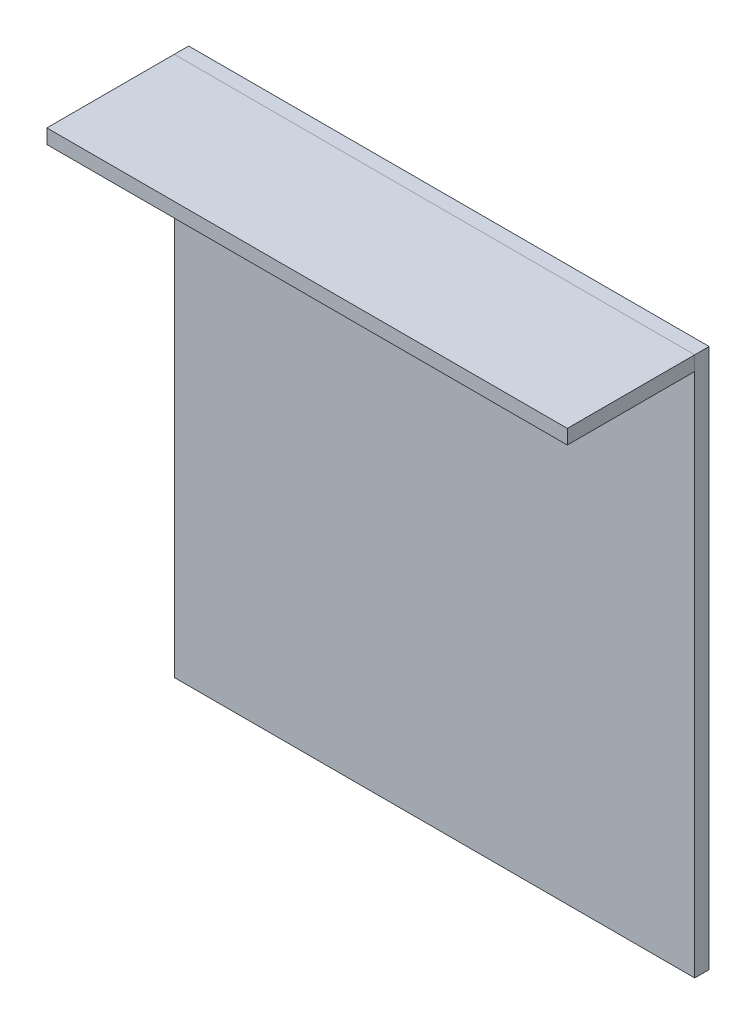
ISO-10303-21;
HEADER;
FILE_DESCRIPTION(('STEP AP214'),'2;1');
FILE_NAME('part.step','',(''),(''),'','','');
FILE_SCHEMA(('AUTOMOTIVE_DESIGN { 1 0 10303 214 1 1 1 1 }'));
ENDSEC;
DATA;
#1=APPLICATION_CONTEXT('core data for automotive mechanical design processes');
#2=APPLICATION_PROTOCOL_DEFINITION('international standard','automotive_design',2000,#1);
#3=PRODUCT_CONTEXT('',#1,'mechanical');
#4=PRODUCT('Part','Part','',(#3));
#5=PRODUCT_RELATED_PRODUCT_CATEGORY('part','',(#4));
#6=PRODUCT_DEFINITION_FORMATION('','',#4);
#7=PRODUCT_DEFINITION_CONTEXT('part definition',#1,'design');
#8=PRODUCT_DEFINITION('design','',#6,#7);
#9=PRODUCT_DEFINITION_SHAPE('','',#8);
#10=(LENGTH_UNIT() NAMED_UNIT(*) SI_UNIT(.MILLI.,.METRE.));
#11=(NAMED_UNIT(*) PLANE_ANGLE_UNIT() SI_UNIT($,.RADIAN.));
#12=(NAMED_UNIT(*) SI_UNIT($,.STERADIAN.) SOLID_ANGLE_UNIT());
#13=UNCERTAINTY_MEASURE_WITH_UNIT(LENGTH_MEASURE(1.E-05),#10,'distance_accuracy_value','');
#14=(GEOMETRIC_REPRESENTATION_CONTEXT(3) GLOBAL_UNCERTAINTY_ASSIGNED_CONTEXT((#13)) GLOBAL_UNIT_ASSIGNED_CONTEXT((#10,
#11,#12)) REPRESENTATION_CONTEXT('',''));
#15=CARTESIAN_POINT('',(0.,0.,0.));
#16=DIRECTION('',(0.,0.,1.));
#17=DIRECTION('',(1.,0.,0.));
#18=AXIS2_PLACEMENT_3D('',#15,#16,#17);
#19=CARTESIAN_POINT('',(216.5,219.,118.));
#20=DIRECTION('',(-1.,0.,0.));
#21=DIRECTION('',(0.,0.,1.));
#22=AXIS2_PLACEMENT_3D('',#19,#20,#21);
#23=PLANE('',#22);
#24=DIRECTION('',(0.,1.,0.));
#25=VECTOR('',#24,1.);
#26=CARTESIAN_POINT('',(216.5,219.,12.));
#27=LINE('',#26,#25);
#28=CARTESIAN_POINT('',(216.5,207.,12.));
#29=VERTEX_POINT('',#28);
#30=CARTESIAN_POINT('',(216.5,219.,12.));
#31=VERTEX_POINT('',#30);
#32=EDGE_CURVE('E108',#29,#31,#27,.T.);
#33=ORIENTED_EDGE('',*,*,#32,.T.);
#34=DIRECTION('',(0.,0.,-1.));
#35=VECTOR('',#34,1.);
#36=CARTESIAN_POINT('',(216.5,219.,118.));
#37=LINE('',#36,#35);
#38=CARTESIAN_POINT('',(216.5,219.,118.));
#39=VERTEX_POINT('',#38);
#40=EDGE_CURVE('E12',#39,#31,#37,.T.);
#41=ORIENTED_EDGE('',*,*,#40,.F.);
#42=DIRECTION('',(0.,1.,0.));
#43=VECTOR('',#42,1.);
#44=CARTESIAN_POINT('',(216.5,219.,118.));
#45=LINE('',#44,#43);
#46=CARTESIAN_POINT('',(216.5,207.,118.));
#47=VERTEX_POINT('',#46);
#48=EDGE_CURVE('E96',#47,#39,#45,.T.);
#49=ORIENTED_EDGE('',*,*,#48,.F.);
#50=DIRECTION('',(0.,0.,-1.));
#51=VECTOR('',#50,1.);
#52=CARTESIAN_POINT('',(216.5,207.,118.));
#53=LINE('',#52,#51);
#54=EDGE_CURVE('E104',#47,#29,#53,.T.);
#55=ORIENTED_EDGE('',*,*,#54,.T.);
#56=EDGE_LOOP('',(#33,#41,#49,#55));
#57=FACE_BOUND('',#56,.T.);
#58=ADVANCED_FACE('F45',(#57),#23,.F.);
#59=CARTESIAN_POINT('',(216.5,219.,118.));
#60=DIRECTION('',(0.,-1.,0.));
#61=DIRECTION('',(1.,0.,0.));
#62=AXIS2_PLACEMENT_3D('',#59,#60,#61);
#63=PLANE('',#62);
#64=DIRECTION('',(-1.,0.,0.));
#65=VECTOR('',#64,1.);
#66=CARTESIAN_POINT('',(216.5,219.,12.));
#67=LINE('',#66,#65);
#68=CARTESIAN_POINT('',(-216.5,219.,12.));
#69=VERTEX_POINT('',#68);
#70=EDGE_CURVE('E100',#31,#69,#67,.T.);
#71=ORIENTED_EDGE('',*,*,#70,.T.);
#72=DIRECTION('',(0.,0.,-1.));
#73=VECTOR('',#72,1.);
#74=CARTESIAN_POINT('',(-216.5,219.,118.));
#75=LINE('',#74,#73);
#76=CARTESIAN_POINT('',(-216.5,219.,118.));
#77=VERTEX_POINT('',#76);
#78=EDGE_CURVE('E53',#77,#69,#75,.T.);
#79=ORIENTED_EDGE('',*,*,#78,.F.);
#80=DIRECTION('',(-1.,0.,0.));
#81=VECTOR('',#80,1.);
#82=CARTESIAN_POINT('',(216.5,219.,118.));
#83=LINE('',#82,#81);
#84=EDGE_CURVE('E91',#39,#77,#83,.T.);
#85=ORIENTED_EDGE('',*,*,#84,.F.);
#86=ORIENTED_EDGE('',*,*,#40,.T.);
#87=EDGE_LOOP('',(#71,#79,#85,#86));
#88=FACE_BOUND('',#87,.T.);
#89=ADVANCED_FACE('F99',(#88),#63,.F.);
#90=CARTESIAN_POINT('',(-216.5,219.,118.));
#91=DIRECTION('',(1.,0.,0.));
#92=DIRECTION('',(0.,0.,-1.));
#93=AXIS2_PLACEMENT_3D('',#90,#91,#92);
#94=PLANE('',#93);
#95=DIRECTION('',(0.,-1.,0.));
#96=VECTOR('',#95,1.);
#97=CARTESIAN_POINT('',(-216.5,219.,12.));
#98=LINE('',#97,#96);
#99=CARTESIAN_POINT('',(-216.5,207.,12.));
#100=VERTEX_POINT('',#99);
#101=EDGE_CURVE('E78',#69,#100,#98,.T.);
#102=ORIENTED_EDGE('',*,*,#101,.T.);
#103=DIRECTION('',(0.,0.,-1.));
#104=VECTOR('',#103,1.);
#105=CARTESIAN_POINT('',(-216.5,207.,118.));
#106=LINE('',#105,#104);
#107=CARTESIAN_POINT('',(-216.5,207.,118.));
#108=VERTEX_POINT('',#107);
#109=EDGE_CURVE('E101',#108,#100,#106,.T.);
#110=ORIENTED_EDGE('',*,*,#109,.F.);
#111=DIRECTION('',(0.,-1.,0.));
#112=VECTOR('',#111,1.);
#113=CARTESIAN_POINT('',(-216.5,219.,118.));
#114=LINE('',#113,#112);
#115=EDGE_CURVE('E94',#77,#108,#114,.T.);
#116=ORIENTED_EDGE('',*,*,#115,.F.);
#117=ORIENTED_EDGE('',*,*,#78,.T.);
#118=EDGE_LOOP('',(#102,#110,#116,#117));
#119=FACE_BOUND('',#118,.T.);
#120=ADVANCED_FACE('F102',(#119),#94,.F.);
#121=CARTESIAN_POINT('',(216.5,207.,118.));
#122=DIRECTION('',(0.,1.,0.));
#123=DIRECTION('',(-1.,0.,0.));
#124=AXIS2_PLACEMENT_3D('',#121,#122,#123);
#125=PLANE('',#124);
#126=DIRECTION('',(1.,0.,0.));
#127=VECTOR('',#126,1.);
#128=CARTESIAN_POINT('',(216.5,207.,12.));
#129=LINE('',#128,#127);
#130=EDGE_CURVE('E84',#100,#29,#129,.T.);
#131=ORIENTED_EDGE('',*,*,#130,.T.);
#132=ORIENTED_EDGE('',*,*,#54,.F.);
#133=DIRECTION('',(1.,0.,0.));
#134=VECTOR('',#133,1.);
#135=CARTESIAN_POINT('',(216.5,207.,118.));
#136=LINE('',#135,#134);
#137=EDGE_CURVE('E61',#108,#47,#136,.T.);
#138=ORIENTED_EDGE('',*,*,#137,.F.);
#139=ORIENTED_EDGE('',*,*,#109,.T.);
#140=EDGE_LOOP('',(#131,#132,#138,#139));
#141=FACE_BOUND('',#140,.T.);
#142=ADVANCED_FACE('F115',(#141),#125,.F.);
#143=CARTESIAN_POINT('',(0.,0.,118.));
#144=DIRECTION('',(0.,0.,-1.));
#145=DIRECTION('',(-1.,0.,0.));
#146=AXIS2_PLACEMENT_3D('',#143,#144,#145);
#147=PLANE('',#146);
#148=ORIENTED_EDGE('',*,*,#48,.T.);
#149=ORIENTED_EDGE('',*,*,#84,.T.);
#150=ORIENTED_EDGE('',*,*,#115,.T.);
#151=ORIENTED_EDGE('',*,*,#137,.T.);
#152=EDGE_LOOP('',(#148,#149,#150,#151));
#153=FACE_BOUND('',#152,.T.);
#154=ADVANCED_FACE('F92',(#153),#147,.F.);
#155=CARTESIAN_POINT('',(0.,0.,12.));
#156=DIRECTION('',(0.,0.,-1.));
#157=DIRECTION('',(-1.,0.,0.));
#158=AXIS2_PLACEMENT_3D('',#155,#156,#157);
#159=PLANE('',#158);
#160=ORIENTED_EDGE('',*,*,#32,.F.);
#161=ORIENTED_EDGE('',*,*,#130,.F.);
#162=ORIENTED_EDGE('',*,*,#101,.F.);
#163=ORIENTED_EDGE('',*,*,#70,.F.);
#164=EDGE_LOOP('',(#160,#161,#162,#163));
#165=FACE_BOUND('',#164,.T.);
#166=ADVANCED_FACE('F118',(#165),#159,.T.);
#167=CLOSED_SHELL('',(#58,#89,#120,#142,#154,#166));
#168=MANIFOLD_SOLID_BREP('B2',#167);
#169=CARTESIAN_POINT('',(-216.5,-230.,12.));
#170=DIRECTION('',(1.,0.,0.));
#171=DIRECTION('',(0.,1.,0.));
#172=AXIS2_PLACEMENT_3D('',#169,#170,#171);
#173=PLANE('',#172);
#174=DIRECTION('',(0.,-1.,0.));
#175=VECTOR('',#174,1.);
#176=CARTESIAN_POINT('',(-216.5,-230.,0.));
#177=LINE('',#176,#175);
#178=CARTESIAN_POINT('',(-216.5,219.,0.));
#179=VERTEX_POINT('',#178);
#180=CARTESIAN_POINT('',(-216.5,-230.,0.));
#181=VERTEX_POINT('',#180);
#182=EDGE_CURVE('E232',#179,#181,#177,.T.);
#183=ORIENTED_EDGE('',*,*,#182,.T.);
#184=DIRECTION('',(0.,0.,-1.));
#185=VECTOR('',#184,1.);
#186=CARTESIAN_POINT('',(-216.5,-230.,12.));
#187=LINE('',#186,#185);
#188=CARTESIAN_POINT('',(-216.5,-230.,12.));
#189=VERTEX_POINT('',#188);
#190=EDGE_CURVE('E43',#189,#181,#187,.T.);
#191=ORIENTED_EDGE('',*,*,#190,.F.);
#192=DIRECTION('',(0.,-1.,0.));
#193=VECTOR('',#192,1.);
#194=CARTESIAN_POINT('',(-216.5,-230.,12.));
#195=LINE('',#194,#193);
#196=CARTESIAN_POINT('',(-216.5,219.,12.));
#197=VERTEX_POINT('',#196);
#198=EDGE_CURVE('E220',#197,#189,#195,.T.);
#199=ORIENTED_EDGE('',*,*,#198,.F.);
#200=DIRECTION('',(0.,0.,-1.));
#201=VECTOR('',#200,1.);
#202=CARTESIAN_POINT('',(-216.5,219.,12.));
#203=LINE('',#202,#201);
#204=EDGE_CURVE('E228',#197,#179,#203,.T.);
#205=ORIENTED_EDGE('',*,*,#204,.T.);
#206=EDGE_LOOP('',(#183,#191,#199,#205));
#207=FACE_BOUND('',#206,.T.);
#208=ADVANCED_FACE('F169',(#207),#173,.F.);
#209=CARTESIAN_POINT('',(-216.5,-230.,12.));
#210=DIRECTION('',(0.,1.,0.));
#211=DIRECTION('',(-1.,0.,0.));
#212=AXIS2_PLACEMENT_3D('',#209,#210,#211);
#213=PLANE('',#212);
#214=DIRECTION('',(1.,0.,0.));
#215=VECTOR('',#214,1.);
#216=CARTESIAN_POINT('',(-216.5,-230.,0.));
#217=LINE('',#216,#215);
#218=CARTESIAN_POINT('',(216.5,-230.,0.));
#219=VERTEX_POINT('',#218);
#220=EDGE_CURVE('E224',#181,#219,#217,.T.);
#221=ORIENTED_EDGE('',*,*,#220,.T.);
#222=DIRECTION('',(0.,0.,-1.));
#223=VECTOR('',#222,1.);
#224=CARTESIAN_POINT('',(216.5,-230.,12.));
#225=LINE('',#224,#223);
#226=CARTESIAN_POINT('',(216.5,-230.,12.));
#227=VERTEX_POINT('',#226);
#228=EDGE_CURVE('E177',#227,#219,#225,.T.);
#229=ORIENTED_EDGE('',*,*,#228,.F.);
#230=DIRECTION('',(1.,0.,0.));
#231=VECTOR('',#230,1.);
#232=CARTESIAN_POINT('',(-216.5,-230.,12.));
#233=LINE('',#232,#231);
#234=EDGE_CURVE('E215',#189,#227,#233,.T.);
#235=ORIENTED_EDGE('',*,*,#234,.F.);
#236=ORIENTED_EDGE('',*,*,#190,.T.);
#237=EDGE_LOOP('',(#221,#229,#235,#236));
#238=FACE_BOUND('',#237,.T.);
#239=ADVANCED_FACE('F223',(#238),#213,.F.);
#240=CARTESIAN_POINT('',(216.5,-230.,12.));
#241=DIRECTION('',(-1.,0.,0.));
#242=DIRECTION('',(0.,-1.,0.));
#243=AXIS2_PLACEMENT_3D('',#240,#241,#242);
#244=PLANE('',#243);
#245=DIRECTION('',(0.,1.,0.));
#246=VECTOR('',#245,1.);
#247=CARTESIAN_POINT('',(216.5,-230.,0.));
#248=LINE('',#247,#246);
#249=CARTESIAN_POINT('',(216.5,219.,0.));
#250=VERTEX_POINT('',#249);
#251=EDGE_CURVE('E202',#219,#250,#248,.T.);
#252=ORIENTED_EDGE('',*,*,#251,.T.);
#253=DIRECTION('',(0.,0.,-1.));
#254=VECTOR('',#253,1.);
#255=CARTESIAN_POINT('',(216.5,219.,12.));
#256=LINE('',#255,#254);
#257=CARTESIAN_POINT('',(216.5,219.,12.));
#258=VERTEX_POINT('',#257);
#259=EDGE_CURVE('E225',#258,#250,#256,.T.);
#260=ORIENTED_EDGE('',*,*,#259,.F.);
#261=DIRECTION('',(0.,1.,0.));
#262=VECTOR('',#261,1.);
#263=CARTESIAN_POINT('',(216.5,-230.,12.));
#264=LINE('',#263,#262);
#265=EDGE_CURVE('E218',#227,#258,#264,.T.);
#266=ORIENTED_EDGE('',*,*,#265,.F.);
#267=ORIENTED_EDGE('',*,*,#228,.T.);
#268=EDGE_LOOP('',(#252,#260,#266,#267));
#269=FACE_BOUND('',#268,.T.);
#270=ADVANCED_FACE('F226',(#269),#244,.F.);
#271=CARTESIAN_POINT('',(-216.5,219.,12.));
#272=DIRECTION('',(0.,-1.,0.));
#273=DIRECTION('',(0.,0.,-1.));
#274=AXIS2_PLACEMENT_3D('',#271,#272,#273);
#275=PLANE('',#274);
#276=DIRECTION('',(-1.,0.,0.));
#277=VECTOR('',#276,1.);
#278=CARTESIAN_POINT('',(-216.5,219.,0.));
#279=LINE('',#278,#277);
#280=EDGE_CURVE('E208',#250,#179,#279,.T.);
#281=ORIENTED_EDGE('',*,*,#280,.T.);
#282=ORIENTED_EDGE('',*,*,#204,.F.);
#283=DIRECTION('',(-1.,0.,0.));
#284=VECTOR('',#283,1.);
#285=CARTESIAN_POINT('',(-216.5,219.,12.));
#286=LINE('',#285,#284);
#287=EDGE_CURVE('E185',#258,#197,#286,.T.);
#288=ORIENTED_EDGE('',*,*,#287,.F.);
#289=ORIENTED_EDGE('',*,*,#259,.T.);
#290=EDGE_LOOP('',(#281,#282,#288,#289));
#291=FACE_BOUND('',#290,.T.);
#292=ADVANCED_FACE('F240',(#291),#275,.F.);
#293=CARTESIAN_POINT('',(0.,0.,12.));
#294=DIRECTION('',(0.,0.,-1.));
#295=DIRECTION('',(-1.,0.,0.));
#296=AXIS2_PLACEMENT_3D('',#293,#294,#295);
#297=PLANE('',#296);
#298=ORIENTED_EDGE('',*,*,#198,.T.);
#299=ORIENTED_EDGE('',*,*,#234,.T.);
#300=ORIENTED_EDGE('',*,*,#265,.T.);
#301=ORIENTED_EDGE('',*,*,#287,.T.);
#302=EDGE_LOOP('',(#298,#299,#300,#301));
#303=FACE_BOUND('',#302,.T.);
#304=ADVANCED_FACE('F216',(#303),#297,.F.);
#305=CARTESIAN_POINT('',(0.,0.,0.));
#306=DIRECTION('',(0.,0.,-1.));
#307=DIRECTION('',(-1.,0.,0.));
#308=AXIS2_PLACEMENT_3D('',#305,#306,#307);
#309=PLANE('',#308);
#310=CARTESIAN_POINT('',(158.488226886294,-161.,0.));
#311=DIRECTION('',(0.,0.,-1.));
#312=DIRECTION('',(-1.,0.,0.));
#313=AXIS2_PLACEMENT_3D('',#310,#311,#312);
#314=CIRCLE('',#313,2.5);
#315=CARTESIAN_POINT('',(155.988226886294,-161.,0.));
#316=VERTEX_POINT('',#315);
#317=EDGE_CURVE('E264',#316,#316,#314,.T.);
#318=ORIENTED_EDGE('',*,*,#317,.F.);
#319=EDGE_LOOP('',(#318));
#320=FACE_BOUND('',#319,.T.);
#321=CARTESIAN_POINT('',(158.488226886294,-129.,0.));
#322=DIRECTION('',(0.,0.,-1.));
#323=DIRECTION('',(-1.,0.,0.));
#324=AXIS2_PLACEMENT_3D('',#321,#322,#323);
#325=CIRCLE('',#324,2.5);
#326=CARTESIAN_POINT('',(155.988226886294,-129.,0.));
#327=VERTEX_POINT('',#326);
#328=EDGE_CURVE('E258',#327,#327,#325,.T.);
#329=ORIENTED_EDGE('',*,*,#328,.F.);
#330=EDGE_LOOP('',(#329));
#331=FACE_BOUND('',#330,.T.);
#332=CARTESIAN_POINT('',(-210.5,-129.,0.));
#333=DIRECTION('',(0.,0.,-1.));
#334=DIRECTION('',(-1.,0.,0.));
#335=AXIS2_PLACEMENT_3D('',#332,#333,#334);
#336=CIRCLE('',#335,2.50000000000002);
#337=CARTESIAN_POINT('',(-213.,-129.,0.));
#338=VERTEX_POINT('',#337);
#339=EDGE_CURVE('E252',#338,#338,#336,.T.);
#340=ORIENTED_EDGE('',*,*,#339,.F.);
#341=EDGE_LOOP('',(#340));
#342=FACE_BOUND('',#341,.T.);
#343=CARTESIAN_POINT('',(-210.5,-161.,0.));
#344=DIRECTION('',(0.,0.,-1.));
#345=DIRECTION('',(-1.,0.,0.));
#346=AXIS2_PLACEMENT_3D('',#343,#344,#345);
#347=CIRCLE('',#346,2.50000000000002);
#348=CARTESIAN_POINT('',(-213.,-161.,0.));
#349=VERTEX_POINT('',#348);
#350=EDGE_CURVE('E246',#349,#349,#347,.T.);
#351=ORIENTED_EDGE('',*,*,#350,.F.);
#352=EDGE_LOOP('',(#351));
#353=FACE_BOUND('',#352,.T.);
#354=ORIENTED_EDGE('',*,*,#182,.F.);
#355=ORIENTED_EDGE('',*,*,#280,.F.);
#356=ORIENTED_EDGE('',*,*,#251,.F.);
#357=ORIENTED_EDGE('',*,*,#220,.F.);
#358=EDGE_LOOP('',(#354,#355,#356,#357));
#359=FACE_BOUND('',#358,.T.);
#360=ADVANCED_FACE('F243',(#320,#331,#342,#353,#359),#309,.T.);
#361=CARTESIAN_POINT('',(-210.5,-161.,6.));
#362=DIRECTION('',(0.,0.,-1.));
#363=DIRECTION('',(-1.,0.,0.));
#364=AXIS2_PLACEMENT_3D('',#361,#362,#363);
#365=CYLINDRICAL_SURFACE('',#364,2.50000000000002);
#366=CARTESIAN_POINT('',(-210.5,-161.,6.));
#367=DIRECTION('',(0.,0.,-1.));
#368=DIRECTION('',(-1.,0.,0.));
#369=AXIS2_PLACEMENT_3D('',#366,#367,#368);
#370=CIRCLE('',#369,2.50000000000002);
#371=CARTESIAN_POINT('',(-213.,-161.,6.));
#372=VERTEX_POINT('',#371);
#373=EDGE_CURVE('E235',#372,#372,#370,.T.);
#374=ORIENTED_EDGE('',*,*,#373,.F.);
#375=EDGE_LOOP('',(#374));
#376=FACE_BOUND('',#375,.T.);
#377=ORIENTED_EDGE('',*,*,#350,.T.);
#378=EDGE_LOOP('',(#377));
#379=FACE_BOUND('',#378,.T.);
#380=ADVANCED_FACE('F281',(#376,#379),#365,.F.);
#381=CARTESIAN_POINT('',(-210.5,-161.,6.));
#382=DIRECTION('',(0.,0.,-1.));
#383=DIRECTION('',(-1.,0.,0.));
#384=AXIS2_PLACEMENT_3D('',#381,#382,#383);
#385=PLANE('',#384);
#386=ORIENTED_EDGE('',*,*,#373,.T.);
#387=EDGE_LOOP('',(#386));
#388=FACE_BOUND('',#387,.T.);
#389=ADVANCED_FACE('F290',(#388),#385,.T.);
#390=CARTESIAN_POINT('',(-210.5,-129.,6.));
#391=DIRECTION('',(0.,0.,-1.));
#392=DIRECTION('',(-1.,0.,0.));
#393=AXIS2_PLACEMENT_3D('',#390,#391,#392);
#394=CYLINDRICAL_SURFACE('',#393,2.50000000000002);
#395=CARTESIAN_POINT('',(-210.5,-129.,6.));
#396=DIRECTION('',(0.,0.,-1.));
#397=DIRECTION('',(-1.,0.,0.));
#398=AXIS2_PLACEMENT_3D('',#395,#396,#397);
#399=CIRCLE('',#398,2.50000000000002);
#400=CARTESIAN_POINT('',(-213.,-129.,6.));
#401=VERTEX_POINT('',#400);
#402=EDGE_CURVE('E249',#401,#401,#399,.T.);
#403=ORIENTED_EDGE('',*,*,#402,.F.);
#404=EDGE_LOOP('',(#403));
#405=FACE_BOUND('',#404,.T.);
#406=ORIENTED_EDGE('',*,*,#339,.T.);
#407=EDGE_LOOP('',(#406));
#408=FACE_BOUND('',#407,.T.);
#409=ADVANCED_FACE('F296',(#405,#408),#394,.F.);
#410=CARTESIAN_POINT('',(-210.5,-129.,6.));
#411=DIRECTION('',(0.,0.,-1.));
#412=DIRECTION('',(-1.,0.,0.));
#413=AXIS2_PLACEMENT_3D('',#410,#411,#412);
#414=PLANE('',#413);
#415=ORIENTED_EDGE('',*,*,#402,.T.);
#416=EDGE_LOOP('',(#415));
#417=FACE_BOUND('',#416,.T.);
#418=ADVANCED_FACE('F339',(#417),#414,.T.);
#419=CARTESIAN_POINT('',(158.488226886294,-129.,6.));
#420=DIRECTION('',(0.,0.,-1.));
#421=DIRECTION('',(-1.,0.,0.));
#422=AXIS2_PLACEMENT_3D('',#419,#420,#421);
#423=CYLINDRICAL_SURFACE('',#422,2.5);
#424=CARTESIAN_POINT('',(158.488226886294,-129.,6.));
#425=DIRECTION('',(0.,0.,-1.));
#426=DIRECTION('',(-1.,0.,0.));
#427=AXIS2_PLACEMENT_3D('',#424,#425,#426);
#428=CIRCLE('',#427,2.5);
#429=CARTESIAN_POINT('',(155.988226886294,-129.,6.));
#430=VERTEX_POINT('',#429);
#431=EDGE_CURVE('E255',#430,#430,#428,.T.);
#432=ORIENTED_EDGE('',*,*,#431,.F.);
#433=EDGE_LOOP('',(#432));
#434=FACE_BOUND('',#433,.T.);
#435=ORIENTED_EDGE('',*,*,#328,.T.);
#436=EDGE_LOOP('',(#435));
#437=FACE_BOUND('',#436,.T.);
#438=ADVANCED_FACE('F349',(#434,#437),#423,.F.);
#439=CARTESIAN_POINT('',(158.488226886294,-129.,6.));
#440=DIRECTION('',(0.,0.,-1.));
#441=DIRECTION('',(-1.,0.,0.));
#442=AXIS2_PLACEMENT_3D('',#439,#440,#441);
#443=PLANE('',#442);
#444=ORIENTED_EDGE('',*,*,#431,.T.);
#445=EDGE_LOOP('',(#444));
#446=FACE_BOUND('',#445,.T.);
#447=ADVANCED_FACE('F275',(#446),#443,.T.);
#448=CARTESIAN_POINT('',(158.488226886294,-161.,6.));
#449=DIRECTION('',(0.,0.,-1.));
#450=DIRECTION('',(-1.,0.,0.));
#451=AXIS2_PLACEMENT_3D('',#448,#449,#450);
#452=CYLINDRICAL_SURFACE('',#451,2.5);
#453=CARTESIAN_POINT('',(158.488226886294,-161.,6.));
#454=DIRECTION('',(0.,0.,-1.));
#455=DIRECTION('',(-1.,0.,0.));
#456=AXIS2_PLACEMENT_3D('',#453,#454,#455);
#457=CIRCLE('',#456,2.5);
#458=CARTESIAN_POINT('',(155.988226886294,-161.,6.));
#459=VERTEX_POINT('',#458);
#460=EDGE_CURVE('E261',#459,#459,#457,.T.);
#461=ORIENTED_EDGE('',*,*,#460,.F.);
#462=EDGE_LOOP('',(#461));
#463=FACE_BOUND('',#462,.T.);
#464=ORIENTED_EDGE('',*,*,#317,.T.);
#465=EDGE_LOOP('',(#464));
#466=FACE_BOUND('',#465,.T.);
#467=ADVANCED_FACE('F272',(#463,#466),#452,.F.);
#468=CARTESIAN_POINT('',(158.488226886294,-161.,6.));
#469=DIRECTION('',(0.,0.,-1.));
#470=DIRECTION('',(-1.,0.,0.));
#471=AXIS2_PLACEMENT_3D('',#468,#469,#470);
#472=PLANE('',#471);
#473=ORIENTED_EDGE('',*,*,#460,.T.);
#474=EDGE_LOOP('',(#473));
#475=FACE_BOUND('',#474,.T.);
#476=ADVANCED_FACE('F270',(#475),#472,.T.);
#477=CLOSED_SHELL('',(#208,#239,#270,#292,#304,#360,#380,#389,#409,#418,#438,#447,#467,#476));
#478=MANIFOLD_SOLID_BREP('B6',#477);
#479=ADVANCED_BREP_SHAPE_REPRESENTATION('',(#18,#168,#478),#14);
#480=SHAPE_DEFINITION_REPRESENTATION(#9,#479);
ENDSEC;
END-ISO-10303-21;
